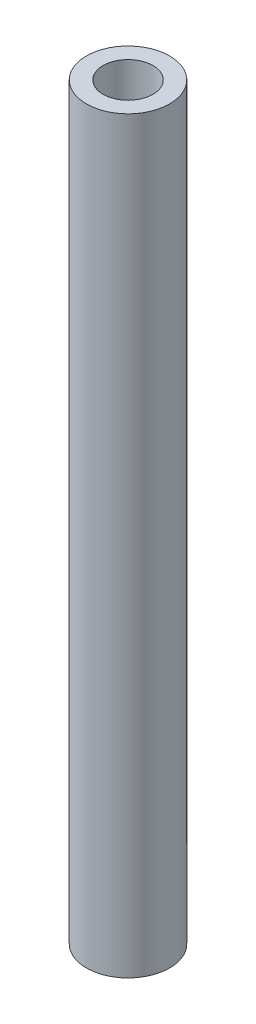
ISO-10303-21;
HEADER;
FILE_DESCRIPTION(('STEP AP214'),'2;1');
FILE_NAME('part.step','',(''),(''),'','','');
FILE_SCHEMA(('AUTOMOTIVE_DESIGN { 1 0 10303 214 1 1 1 1 }'));
ENDSEC;
DATA;
#1=APPLICATION_CONTEXT('core data for automotive mechanical design processes');
#2=APPLICATION_PROTOCOL_DEFINITION('international standard','automotive_design',2000,#1);
#3=PRODUCT_CONTEXT('',#1,'mechanical');
#4=PRODUCT('Part','Part','',(#3));
#5=PRODUCT_RELATED_PRODUCT_CATEGORY('part','',(#4));
#6=PRODUCT_DEFINITION_FORMATION('','',#4);
#7=PRODUCT_DEFINITION_CONTEXT('part definition',#1,'design');
#8=PRODUCT_DEFINITION('design','',#6,#7);
#9=PRODUCT_DEFINITION_SHAPE('','',#8);
#10=(LENGTH_UNIT() NAMED_UNIT(*) SI_UNIT(.MILLI.,.METRE.));
#11=(NAMED_UNIT(*) PLANE_ANGLE_UNIT() SI_UNIT($,.RADIAN.));
#12=(NAMED_UNIT(*) SI_UNIT($,.STERADIAN.) SOLID_ANGLE_UNIT());
#13=UNCERTAINTY_MEASURE_WITH_UNIT(LENGTH_MEASURE(1.E-05),#10,'distance_accuracy_value','');
#14=(GEOMETRIC_REPRESENTATION_CONTEXT(3) GLOBAL_UNCERTAINTY_ASSIGNED_CONTEXT((#13)) GLOBAL_UNIT_ASSIGNED_CONTEXT((#10,
#11,#12)) REPRESENTATION_CONTEXT('',''));
#15=CARTESIAN_POINT('',(0.,0.,0.));
#16=DIRECTION('',(0.,0.,1.));
#17=DIRECTION('',(1.,0.,0.));
#18=AXIS2_PLACEMENT_3D('',#15,#16,#17);
#19=CARTESIAN_POINT('',(0.,45.,0.));
#20=DIRECTION('',(0.,1.,0.));
#21=DIRECTION('',(0.,0.,1.));
#22=AXIS2_PLACEMENT_3D('',#19,#20,#21);
#23=PLANE('',#22);
#24=CARTESIAN_POINT('',(0.,45.,0.));
#25=DIRECTION('',(0.,1.,0.));
#26=DIRECTION('',(0.,0.,1.));
#27=AXIS2_PLACEMENT_3D('',#24,#25,#26);
#28=CIRCLE('',#27,2.5);
#29=CARTESIAN_POINT('',(0.,45.,-2.5));
#30=VERTEX_POINT('',#29);
#31=EDGE_CURVE('E10',#30,#30,#28,.T.);
#32=ORIENTED_EDGE('',*,*,#31,.T.);
#33=EDGE_LOOP('',(#32));
#34=FACE_BOUND('',#33,.T.);
#35=CARTESIAN_POINT('',(0.,45.,0.));
#36=DIRECTION('',(0.,1.,0.));
#37=DIRECTION('',(0.,0.,1.));
#38=AXIS2_PLACEMENT_3D('',#35,#36,#37);
#39=CIRCLE('',#38,1.5);
#40=CARTESIAN_POINT('',(0.,45.,-1.5));
#41=VERTEX_POINT('',#40);
#42=EDGE_CURVE('E43',#41,#41,#39,.T.);
#43=ORIENTED_EDGE('',*,*,#42,.F.);
#44=EDGE_LOOP('',(#43));
#45=FACE_BOUND('',#44,.T.);
#46=ADVANCED_FACE('F32',(#34,#45),#23,.T.);
#47=CARTESIAN_POINT('',(0.,0.,0.));
#48=DIRECTION('',(0.,1.,0.));
#49=DIRECTION('',(0.,0.,1.));
#50=AXIS2_PLACEMENT_3D('',#47,#48,#49);
#51=PLANE('',#50);
#52=CARTESIAN_POINT('',(0.,0.,0.));
#53=DIRECTION('',(0.,1.,0.));
#54=DIRECTION('',(0.,0.,1.));
#55=AXIS2_PLACEMENT_3D('',#52,#53,#54);
#56=CIRCLE('',#55,2.5);
#57=CARTESIAN_POINT('',(0.,0.,-2.5));
#58=VERTEX_POINT('',#57);
#59=EDGE_CURVE('E36',#58,#58,#56,.T.);
#60=ORIENTED_EDGE('',*,*,#59,.F.);
#61=EDGE_LOOP('',(#60));
#62=FACE_BOUND('',#61,.T.);
#63=CARTESIAN_POINT('',(0.,0.,0.));
#64=DIRECTION('',(0.,1.,0.));
#65=DIRECTION('',(0.,0.,1.));
#66=AXIS2_PLACEMENT_3D('',#63,#64,#65);
#67=CIRCLE('',#66,1.5);
#68=CARTESIAN_POINT('',(0.,0.,-1.5));
#69=VERTEX_POINT('',#68);
#70=EDGE_CURVE('E45',#69,#69,#67,.T.);
#71=ORIENTED_EDGE('',*,*,#70,.T.);
#72=EDGE_LOOP('',(#71));
#73=FACE_BOUND('',#72,.T.);
#74=ADVANCED_FACE('F55',(#62,#73),#51,.F.);
#75=CARTESIAN_POINT('',(0.,45.,0.));
#76=DIRECTION('',(0.,-1.,0.));
#77=DIRECTION('',(0.,0.,-1.));
#78=AXIS2_PLACEMENT_3D('',#75,#76,#77);
#79=CYLINDRICAL_SURFACE('',#78,2.5);
#80=CARTESIAN_POINT('',(0.,45.,-2.5));
#81=CARTESIAN_POINT('',(0.,44.53125,-2.5));
#82=CARTESIAN_POINT('',(0.,44.0625,-2.5));
#83=CARTESIAN_POINT('',(0.,43.125,-2.5));
#84=CARTESIAN_POINT('',(0.,42.65625,-2.5));
#85=CARTESIAN_POINT('',(0.,41.71875,-2.5));
#86=CARTESIAN_POINT('',(0.,41.25,-2.5));
#87=CARTESIAN_POINT('',(0.,40.3125,-2.5));
#88=CARTESIAN_POINT('',(0.,39.84375,-2.5));
#89=CARTESIAN_POINT('',(0.,38.90625,-2.5));
#90=CARTESIAN_POINT('',(0.,38.4375,-2.5));
#91=CARTESIAN_POINT('',(0.,37.5,-2.5));
#92=CARTESIAN_POINT('',(0.,37.03125,-2.5));
#93=CARTESIAN_POINT('',(0.,36.09375,-2.5));
#94=CARTESIAN_POINT('',(0.,35.625,-2.5));
#95=CARTESIAN_POINT('',(0.,34.6875,-2.5));
#96=CARTESIAN_POINT('',(0.,34.21875,-2.5));
#97=CARTESIAN_POINT('',(0.,33.28125,-2.5));
#98=CARTESIAN_POINT('',(0.,32.8125,-2.5));
#99=CARTESIAN_POINT('',(0.,31.875,-2.5));
#100=CARTESIAN_POINT('',(0.,31.40625,-2.5));
#101=CARTESIAN_POINT('',(0.,30.46875,-2.5));
#102=CARTESIAN_POINT('',(0.,30.,-2.5));
#103=CARTESIAN_POINT('',(0.,29.0625,-2.5));
#104=CARTESIAN_POINT('',(0.,28.59375,-2.5));
#105=CARTESIAN_POINT('',(0.,27.65625,-2.5));
#106=CARTESIAN_POINT('',(0.,27.1875,-2.5));
#107=CARTESIAN_POINT('',(0.,26.25,-2.5));
#108=CARTESIAN_POINT('',(0.,25.78125,-2.5));
#109=CARTESIAN_POINT('',(0.,24.84375,-2.5));
#110=CARTESIAN_POINT('',(0.,24.375,-2.5));
#111=CARTESIAN_POINT('',(0.,23.4375,-2.5));
#112=CARTESIAN_POINT('',(0.,22.96875,-2.5));
#113=CARTESIAN_POINT('',(0.,22.03125,-2.5));
#114=CARTESIAN_POINT('',(0.,21.5625,-2.5));
#115=CARTESIAN_POINT('',(0.,20.625,-2.5));
#116=CARTESIAN_POINT('',(0.,20.15625,-2.5));
#117=CARTESIAN_POINT('',(0.,19.21875,-2.5));
#118=CARTESIAN_POINT('',(0.,18.75,-2.5));
#119=CARTESIAN_POINT('',(0.,17.8125,-2.5));
#120=CARTESIAN_POINT('',(0.,17.34375,-2.5));
#121=CARTESIAN_POINT('',(0.,16.40625,-2.5));
#122=CARTESIAN_POINT('',(0.,15.9375,-2.5));
#123=CARTESIAN_POINT('',(0.,15.,-2.5));
#124=CARTESIAN_POINT('',(0.,14.53125,-2.5));
#125=CARTESIAN_POINT('',(0.,13.59375,-2.5));
#126=CARTESIAN_POINT('',(0.,13.125,-2.5));
#127=CARTESIAN_POINT('',(0.,12.1875,-2.5));
#128=CARTESIAN_POINT('',(0.,11.71875,-2.5));
#129=CARTESIAN_POINT('',(0.,10.78125,-2.5));
#130=CARTESIAN_POINT('',(0.,10.3125,-2.5));
#131=CARTESIAN_POINT('',(0.,9.37499999999999,-2.5));
#132=CARTESIAN_POINT('',(0.,8.90624999999999,-2.5));
#133=CARTESIAN_POINT('',(0.,7.96874999999999,-2.5));
#134=CARTESIAN_POINT('',(0.,7.5,-2.5));
#135=CARTESIAN_POINT('',(0.,6.56249999999999,-2.5));
#136=CARTESIAN_POINT('',(0.,6.09374999999999,-2.5));
#137=CARTESIAN_POINT('',(0.,5.15624999999999,-2.5));
#138=CARTESIAN_POINT('',(0.,4.68749999999999,-2.5));
#139=CARTESIAN_POINT('',(0.,3.74999999999999,-2.5));
#140=CARTESIAN_POINT('',(0.,3.28124999999999,-2.5));
#141=CARTESIAN_POINT('',(0.,2.34374999999999,-2.5));
#142=CARTESIAN_POINT('',(0.,1.87499999999999,-2.5));
#143=CARTESIAN_POINT('',(0.,0.937499999999992,-2.5));
#144=CARTESIAN_POINT('',(0.,0.468749999999993,-2.5));
#145=CARTESIAN_POINT('',(0.,0.,-2.5));
#146=B_SPLINE_CURVE_WITH_KNOTS('',3,(#80,#81,#82,#83,#84,#85,#86,#87,#88,#89,#90,#91,#92,#93,
#94,#95,#96,#97,#98,#99,#100,#101,#102,#103,#104,#105,#106,#107,#108,#109,#110,#111,#112,#113,
#114,#115,#116,#117,#118,#119,#120,#121,#122,#123,#124,#125,#126,#127,#128,#129,#130,#131,#132,
#133,#134,#135,#136,#137,#138,#139,#140,#141,#142,#143,#144,#145),.UNSPECIFIED.,.F.,.F.,(4,2,2,
2,2,2,2,2,2,2,2,2,2,2,2,2,2,2,2,2,2,2,2,2,2,2,2,2,2,2,2,2,4),(0.,1.40625,2.8125,
4.21874999999999,5.625,7.03125,8.43749999999999,9.84375,11.25,12.65625,14.0625,15.46875,16.875,
18.28125,19.6875,21.09375,22.5,23.90625,25.3125,26.71875,28.125,29.53125,30.9375,32.34375,33.75,
35.15625,36.5625,37.96875,39.375,40.78125,42.1875,43.59375,45.),.UNSPECIFIED.);
#147=EDGE_CURVE('BSEAM34',#30,#58,#146,.T.);
#148=ORIENTED_EDGE('',*,*,#31,.F.);
#149=ORIENTED_EDGE('',*,*,#59,.T.);
#150=ORIENTED_EDGE('',*,*,#147,.T.);
#151=ORIENTED_EDGE('',*,*,#147,.F.);
#152=EDGE_LOOP('',(#148,#150,#149,#151));
#153=FACE_BOUND('',#152,.T.);
#154=ADVANCED_FACE('F34',(#153),#79,.T.);
#155=CARTESIAN_POINT('',(0.,45.,0.));
#156=DIRECTION('',(0.,-1.,0.));
#157=DIRECTION('',(0.,0.,-1.));
#158=AXIS2_PLACEMENT_3D('',#155,#156,#157);
#159=CYLINDRICAL_SURFACE('',#158,1.5);
#160=CARTESIAN_POINT('',(0.,45.,-1.5));
#161=CARTESIAN_POINT('',(0.,44.53125,-1.5));
#162=CARTESIAN_POINT('',(0.,44.0625,-1.5));
#163=CARTESIAN_POINT('',(0.,43.125,-1.5));
#164=CARTESIAN_POINT('',(0.,42.65625,-1.5));
#165=CARTESIAN_POINT('',(0.,41.71875,-1.5));
#166=CARTESIAN_POINT('',(0.,41.25,-1.5));
#167=CARTESIAN_POINT('',(0.,40.3125,-1.5));
#168=CARTESIAN_POINT('',(0.,39.84375,-1.5));
#169=CARTESIAN_POINT('',(0.,38.90625,-1.5));
#170=CARTESIAN_POINT('',(0.,38.4375,-1.5));
#171=CARTESIAN_POINT('',(0.,37.5,-1.5));
#172=CARTESIAN_POINT('',(0.,37.03125,-1.5));
#173=CARTESIAN_POINT('',(0.,36.09375,-1.5));
#174=CARTESIAN_POINT('',(0.,35.625,-1.5));
#175=CARTESIAN_POINT('',(0.,34.6875,-1.5));
#176=CARTESIAN_POINT('',(0.,34.21875,-1.5));
#177=CARTESIAN_POINT('',(0.,33.28125,-1.5));
#178=CARTESIAN_POINT('',(0.,32.8125,-1.5));
#179=CARTESIAN_POINT('',(0.,31.875,-1.5));
#180=CARTESIAN_POINT('',(0.,31.40625,-1.5));
#181=CARTESIAN_POINT('',(0.,30.46875,-1.5));
#182=CARTESIAN_POINT('',(0.,30.,-1.5));
#183=CARTESIAN_POINT('',(0.,29.0625,-1.5));
#184=CARTESIAN_POINT('',(0.,28.59375,-1.5));
#185=CARTESIAN_POINT('',(0.,27.65625,-1.5));
#186=CARTESIAN_POINT('',(0.,27.1875,-1.5));
#187=CARTESIAN_POINT('',(0.,26.25,-1.5));
#188=CARTESIAN_POINT('',(0.,25.78125,-1.5));
#189=CARTESIAN_POINT('',(0.,24.84375,-1.5));
#190=CARTESIAN_POINT('',(0.,24.375,-1.5));
#191=CARTESIAN_POINT('',(0.,23.4375,-1.5));
#192=CARTESIAN_POINT('',(0.,22.96875,-1.5));
#193=CARTESIAN_POINT('',(0.,22.03125,-1.5));
#194=CARTESIAN_POINT('',(0.,21.5625,-1.5));
#195=CARTESIAN_POINT('',(0.,20.625,-1.5));
#196=CARTESIAN_POINT('',(0.,20.15625,-1.5));
#197=CARTESIAN_POINT('',(0.,19.21875,-1.5));
#198=CARTESIAN_POINT('',(0.,18.75,-1.5));
#199=CARTESIAN_POINT('',(0.,17.8125,-1.5));
#200=CARTESIAN_POINT('',(0.,17.34375,-1.5));
#201=CARTESIAN_POINT('',(0.,16.40625,-1.5));
#202=CARTESIAN_POINT('',(0.,15.9375,-1.5));
#203=CARTESIAN_POINT('',(0.,15.,-1.5));
#204=CARTESIAN_POINT('',(0.,14.53125,-1.5));
#205=CARTESIAN_POINT('',(0.,13.59375,-1.5));
#206=CARTESIAN_POINT('',(0.,13.125,-1.5));
#207=CARTESIAN_POINT('',(0.,12.1875,-1.5));
#208=CARTESIAN_POINT('',(0.,11.71875,-1.5));
#209=CARTESIAN_POINT('',(0.,10.78125,-1.5));
#210=CARTESIAN_POINT('',(0.,10.3125,-1.5));
#211=CARTESIAN_POINT('',(0.,9.37499999999999,-1.5));
#212=CARTESIAN_POINT('',(0.,8.90624999999999,-1.5));
#213=CARTESIAN_POINT('',(0.,7.96874999999999,-1.5));
#214=CARTESIAN_POINT('',(0.,7.5,-1.5));
#215=CARTESIAN_POINT('',(0.,6.56249999999999,-1.5));
#216=CARTESIAN_POINT('',(0.,6.09374999999999,-1.5));
#217=CARTESIAN_POINT('',(0.,5.15624999999999,-1.5));
#218=CARTESIAN_POINT('',(0.,4.68749999999999,-1.5));
#219=CARTESIAN_POINT('',(0.,3.74999999999999,-1.5));
#220=CARTESIAN_POINT('',(0.,3.28124999999999,-1.5));
#221=CARTESIAN_POINT('',(0.,2.34374999999999,-1.5));
#222=CARTESIAN_POINT('',(0.,1.87499999999999,-1.5));
#223=CARTESIAN_POINT('',(0.,0.937499999999992,-1.5));
#224=CARTESIAN_POINT('',(0.,0.468749999999993,-1.5));
#225=CARTESIAN_POINT('',(0.,0.,-1.5));
#226=B_SPLINE_CURVE_WITH_KNOTS('',3,(#160,#161,#162,#163,#164,#165,#166,#167,#168,#169,#170,
#171,#172,#173,#174,#175,#176,#177,#178,#179,#180,#181,#182,#183,#184,#185,#186,#187,#188,#189,
#190,#191,#192,#193,#194,#195,#196,#197,#198,#199,#200,#201,#202,#203,#204,#205,#206,#207,#208,
#209,#210,#211,#212,#213,#214,#215,#216,#217,#218,#219,#220,#221,#222,#223,#224,#225),
.UNSPECIFIED.,.F.,.F.,(4,2,2,2,2,2,2,2,2,2,2,2,2,2,2,2,2,2,2,2,2,2,2,2,2,2,2,2,2,2,2,2,4),(0.,
1.40625,2.8125,4.21874999999999,5.625,7.03125,8.43749999999999,9.84375,11.25,12.65625,14.0625,
15.46875,16.875,18.28125,19.6875,21.09375,22.5,23.90625,25.3125,26.71875,28.125,29.53125,
30.9375,32.34375,33.75,35.15625,36.5625,37.96875,39.375,40.78125,42.1875,43.59375,45.),.UNSPECIFIED.);
#227=EDGE_CURVE('BSEAM51',#41,#69,#226,.T.);
#228=ORIENTED_EDGE('',*,*,#42,.T.);
#229=ORIENTED_EDGE('',*,*,#70,.F.);
#230=ORIENTED_EDGE('',*,*,#227,.T.);
#231=ORIENTED_EDGE('',*,*,#227,.F.);
#232=EDGE_LOOP('',(#228,#230,#229,#231));
#233=FACE_BOUND('',#232,.T.);
#234=ADVANCED_FACE('F51',(#233),#159,.F.);
#235=CLOSED_SHELL('',(#46,#74,#154,#234));
#236=MANIFOLD_SOLID_BREP('B2',#235);
#237=ADVANCED_BREP_SHAPE_REPRESENTATION('',(#18,#236),#14);
#238=SHAPE_DEFINITION_REPRESENTATION(#9,#237);
ENDSEC;
END-ISO-10303-21;
